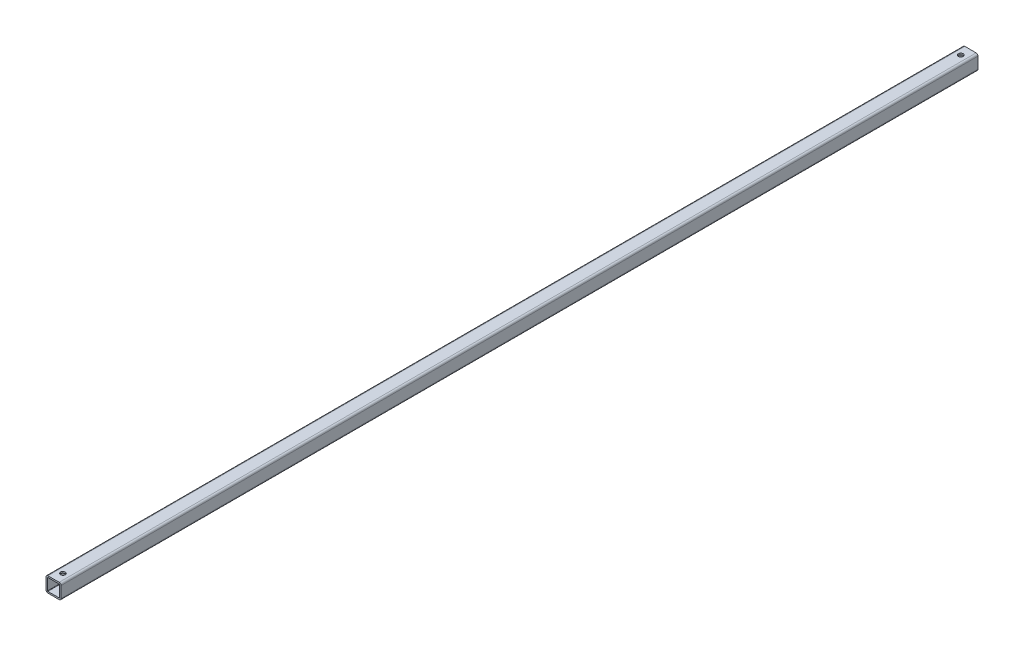
ISO-10303-21;
HEADER;
FILE_DESCRIPTION(('STEP AP214'),'2;1');
FILE_NAME('part.step','',(''),(''),'','','');
FILE_SCHEMA(('AUTOMOTIVE_DESIGN { 1 0 10303 214 1 1 1 1 }'));
ENDSEC;
DATA;
#1=APPLICATION_CONTEXT('core data for automotive mechanical design processes');
#2=APPLICATION_PROTOCOL_DEFINITION('international standard','automotive_design',2000,#1);
#3=PRODUCT_CONTEXT('',#1,'mechanical');
#4=PRODUCT('Part','Part','',(#3));
#5=PRODUCT_RELATED_PRODUCT_CATEGORY('part','',(#4));
#6=PRODUCT_DEFINITION_FORMATION('','',#4);
#7=PRODUCT_DEFINITION_CONTEXT('part definition',#1,'design');
#8=PRODUCT_DEFINITION('design','',#6,#7);
#9=PRODUCT_DEFINITION_SHAPE('','',#8);
#10=(LENGTH_UNIT() NAMED_UNIT(*) SI_UNIT(.MILLI.,.METRE.));
#11=(NAMED_UNIT(*) PLANE_ANGLE_UNIT() SI_UNIT($,.RADIAN.));
#12=(NAMED_UNIT(*) SI_UNIT($,.STERADIAN.) SOLID_ANGLE_UNIT());
#13=UNCERTAINTY_MEASURE_WITH_UNIT(LENGTH_MEASURE(1.E-05),#10,'distance_accuracy_value','');
#14=(GEOMETRIC_REPRESENTATION_CONTEXT(3) GLOBAL_UNCERTAINTY_ASSIGNED_CONTEXT((#13)) GLOBAL_UNIT_ASSIGNED_CONTEXT((#10,
#11,#12)) REPRESENTATION_CONTEXT('',''));
#15=CARTESIAN_POINT('',(0.,0.,0.));
#16=DIRECTION('',(0.,0.,1.));
#17=DIRECTION('',(1.,0.,0.));
#18=AXIS2_PLACEMENT_3D('',#15,#16,#17);
#19=CARTESIAN_POINT('',(-7.5,7.5,609.6));
#20=DIRECTION('',(0.,0.,1.));
#21=DIRECTION('',(1.,0.,0.));
#22=AXIS2_PLACEMENT_3D('',#19,#20,#21);
#23=PLANE('',#22);
#24=CARTESIAN_POINT('',(-7.5,7.5,609.6));
#25=DIRECTION('',(0.,0.,1.));
#26=DIRECTION('',(1.,0.,0.));
#27=AXIS2_PLACEMENT_3D('',#24,#25,#26);
#28=CIRCLE('',#27,2.5);
#29=CARTESIAN_POINT('',(-7.5,10.,609.6));
#30=VERTEX_POINT('',#29);
#31=CARTESIAN_POINT('',(-10.,7.5,609.6));
#32=VERTEX_POINT('',#31);
#33=EDGE_CURVE('E263',#30,#32,#28,.T.);
#34=ORIENTED_EDGE('',*,*,#33,.T.);
#35=DIRECTION('',(0.,-1.,0.));
#36=VECTOR('',#35,1.);
#37=CARTESIAN_POINT('',(-10.,-7.5,609.6));
#38=LINE('',#37,#36);
#39=CARTESIAN_POINT('',(-10.,-7.5,609.6));
#40=VERTEX_POINT('',#39);
#41=EDGE_CURVE('E266',#32,#40,#38,.T.);
#42=ORIENTED_EDGE('',*,*,#41,.T.);
#43=CARTESIAN_POINT('',(-7.5,-7.5,609.6));
#44=DIRECTION('',(0.,0.,1.));
#45=DIRECTION('',(-1.,0.,0.));
#46=AXIS2_PLACEMENT_3D('',#43,#44,#45);
#47=CIRCLE('',#46,2.5);
#48=CARTESIAN_POINT('',(-7.5,-10.,609.6));
#49=VERTEX_POINT('',#48);
#50=EDGE_CURVE('E269',#40,#49,#47,.T.);
#51=ORIENTED_EDGE('',*,*,#50,.T.);
#52=DIRECTION('',(1.,0.,0.));
#53=VECTOR('',#52,1.);
#54=CARTESIAN_POINT('',(7.5,-10.,609.6));
#55=LINE('',#54,#53);
#56=CARTESIAN_POINT('',(7.5,-10.,609.6));
#57=VERTEX_POINT('',#56);
#58=EDGE_CURVE('E271',#49,#57,#55,.T.);
#59=ORIENTED_EDGE('',*,*,#58,.T.);
#60=CARTESIAN_POINT('',(7.5,-7.5,609.6));
#61=DIRECTION('',(0.,0.,1.));
#62=DIRECTION('',(1.,0.,0.));
#63=AXIS2_PLACEMENT_3D('',#60,#61,#62);
#64=CIRCLE('',#63,2.5);
#65=CARTESIAN_POINT('',(10.,-7.5,609.6));
#66=VERTEX_POINT('',#65);
#67=EDGE_CURVE('E273',#57,#66,#64,.T.);
#68=ORIENTED_EDGE('',*,*,#67,.T.);
#69=DIRECTION('',(0.,1.,0.));
#70=VECTOR('',#69,1.);
#71=CARTESIAN_POINT('',(10.,-7.5,609.6));
#72=LINE('',#71,#70);
#73=CARTESIAN_POINT('',(10.,7.5,609.6));
#74=VERTEX_POINT('',#73);
#75=EDGE_CURVE('E275',#66,#74,#72,.T.);
#76=ORIENTED_EDGE('',*,*,#75,.T.);
#77=CARTESIAN_POINT('',(7.5,7.5,609.6));
#78=DIRECTION('',(0.,0.,1.));
#79=DIRECTION('',(1.,0.,0.));
#80=AXIS2_PLACEMENT_3D('',#77,#78,#79);
#81=CIRCLE('',#80,2.5);
#82=CARTESIAN_POINT('',(7.5,10.,609.6));
#83=VERTEX_POINT('',#82);
#84=EDGE_CURVE('E277',#74,#83,#81,.T.);
#85=ORIENTED_EDGE('',*,*,#84,.T.);
#86=DIRECTION('',(-1.,0.,0.));
#87=VECTOR('',#86,1.);
#88=CARTESIAN_POINT('',(7.5,10.,609.6));
#89=LINE('',#88,#87);
#90=EDGE_CURVE('E279',#83,#30,#89,.T.);
#91=ORIENTED_EDGE('',*,*,#90,.T.);
#92=EDGE_LOOP('',(#34,#42,#51,#59,#68,#76,#85,#91));
#93=FACE_BOUND('',#92,.T.);
#94=DIRECTION('',(0.,-1.,0.));
#95=VECTOR('',#94,1.);
#96=CARTESIAN_POINT('',(-8.,-7.5,609.6));
#97=LINE('',#96,#95);
#98=CARTESIAN_POINT('',(-8.,7.5,609.6));
#99=VERTEX_POINT('',#98);
#100=CARTESIAN_POINT('',(-8.,-7.5,609.6));
#101=VERTEX_POINT('',#100);
#102=EDGE_CURVE('E204',#99,#101,#97,.T.);
#103=ORIENTED_EDGE('',*,*,#102,.F.);
#104=CARTESIAN_POINT('',(-7.5,7.5,609.6));
#105=DIRECTION('',(0.,0.,1.));
#106=DIRECTION('',(1.,0.,0.));
#107=AXIS2_PLACEMENT_3D('',#104,#105,#106);
#108=CIRCLE('',#107,0.499999999999999);
#109=CARTESIAN_POINT('',(-7.5,8.,609.6));
#110=VERTEX_POINT('',#109);
#111=EDGE_CURVE('E196',#110,#99,#108,.T.);
#112=ORIENTED_EDGE('',*,*,#111,.F.);
#113=DIRECTION('',(-1.,0.,0.));
#114=VECTOR('',#113,1.);
#115=CARTESIAN_POINT('',(7.5,8.,609.6));
#116=LINE('',#115,#114);
#117=CARTESIAN_POINT('',(7.5,8.,609.6));
#118=VERTEX_POINT('',#117);
#119=EDGE_CURVE('E230',#118,#110,#116,.T.);
#120=ORIENTED_EDGE('',*,*,#119,.F.);
#121=CARTESIAN_POINT('',(7.5,7.5,609.6));
#122=DIRECTION('',(0.,0.,1.));
#123=DIRECTION('',(1.,0.,0.));
#124=AXIS2_PLACEMENT_3D('',#121,#122,#123);
#125=CIRCLE('',#124,0.499999999999999);
#126=CARTESIAN_POINT('',(8.,7.5,609.6));
#127=VERTEX_POINT('',#126);
#128=EDGE_CURVE('E228',#127,#118,#125,.T.);
#129=ORIENTED_EDGE('',*,*,#128,.F.);
#130=DIRECTION('',(0.,1.,0.));
#131=VECTOR('',#130,1.);
#132=CARTESIAN_POINT('',(8.,-7.5,609.6));
#133=LINE('',#132,#131);
#134=CARTESIAN_POINT('',(8.,-7.5,609.6));
#135=VERTEX_POINT('',#134);
#136=EDGE_CURVE('E226',#135,#127,#133,.T.);
#137=ORIENTED_EDGE('',*,*,#136,.F.);
#138=CARTESIAN_POINT('',(7.5,-7.5,609.6));
#139=DIRECTION('',(0.,0.,1.));
#140=DIRECTION('',(1.,0.,0.));
#141=AXIS2_PLACEMENT_3D('',#138,#139,#140);
#142=CIRCLE('',#141,0.500000000000001);
#143=CARTESIAN_POINT('',(7.5,-8.,609.6));
#144=VERTEX_POINT('',#143);
#145=EDGE_CURVE('E224',#144,#135,#142,.T.);
#146=ORIENTED_EDGE('',*,*,#145,.F.);
#147=DIRECTION('',(1.,0.,0.));
#148=VECTOR('',#147,1.);
#149=CARTESIAN_POINT('',(7.5,-8.,609.6));
#150=LINE('',#149,#148);
#151=CARTESIAN_POINT('',(-7.5,-8.,609.6));
#152=VERTEX_POINT('',#151);
#153=EDGE_CURVE('E219',#152,#144,#150,.T.);
#154=ORIENTED_EDGE('',*,*,#153,.F.);
#155=CARTESIAN_POINT('',(-7.5,-7.5,609.6));
#156=DIRECTION('',(0.,0.,1.));
#157=DIRECTION('',(1.,0.,0.));
#158=AXIS2_PLACEMENT_3D('',#155,#156,#157);
#159=CIRCLE('',#158,0.500000000000002);
#160=EDGE_CURVE('E217',#101,#152,#159,.T.);
#161=ORIENTED_EDGE('',*,*,#160,.F.);
#162=EDGE_LOOP('',(#103,#112,#120,#129,#137,#146,#154,#161));
#163=FACE_BOUND('',#162,.T.);
#164=ADVANCED_FACE('F81',(#93,#163),#23,.T.);
#165=CARTESIAN_POINT('',(-7.5,7.5,-609.6));
#166=DIRECTION('',(0.,0.,1.));
#167=DIRECTION('',(1.,0.,0.));
#168=AXIS2_PLACEMENT_3D('',#165,#166,#167);
#169=PLANE('',#168);
#170=CARTESIAN_POINT('',(-7.5,7.5,-609.6));
#171=DIRECTION('',(0.,0.,1.));
#172=DIRECTION('',(1.,0.,0.));
#173=AXIS2_PLACEMENT_3D('',#170,#171,#172);
#174=CIRCLE('',#173,2.5);
#175=CARTESIAN_POINT('',(-7.5,10.,-609.6));
#176=VERTEX_POINT('',#175);
#177=CARTESIAN_POINT('',(-10.,7.5,-609.6));
#178=VERTEX_POINT('',#177);
#179=EDGE_CURVE('E212',#176,#178,#174,.T.);
#180=ORIENTED_EDGE('',*,*,#179,.F.);
#181=DIRECTION('',(-1.,0.,0.));
#182=VECTOR('',#181,1.);
#183=CARTESIAN_POINT('',(7.5,10.,-609.6));
#184=LINE('',#183,#182);
#185=CARTESIAN_POINT('',(7.5,10.,-609.6));
#186=VERTEX_POINT('',#185);
#187=EDGE_CURVE('E267',#186,#176,#184,.T.);
#188=ORIENTED_EDGE('',*,*,#187,.F.);
#189=CARTESIAN_POINT('',(7.5,7.5,-609.6));
#190=DIRECTION('',(0.,0.,1.));
#191=DIRECTION('',(1.,0.,0.));
#192=AXIS2_PLACEMENT_3D('',#189,#190,#191);
#193=CIRCLE('',#192,2.5);
#194=CARTESIAN_POINT('',(10.,7.5,-609.6));
#195=VERTEX_POINT('',#194);
#196=EDGE_CURVE('E294',#195,#186,#193,.T.);
#197=ORIENTED_EDGE('',*,*,#196,.F.);
#198=DIRECTION('',(0.,1.,0.));
#199=VECTOR('',#198,1.);
#200=CARTESIAN_POINT('',(10.,-7.5,-609.6));
#201=LINE('',#200,#199);
#202=CARTESIAN_POINT('',(10.,-7.5,-609.6));
#203=VERTEX_POINT('',#202);
#204=EDGE_CURVE('E292',#203,#195,#201,.T.);
#205=ORIENTED_EDGE('',*,*,#204,.F.);
#206=CARTESIAN_POINT('',(7.5,-7.5,-609.6));
#207=DIRECTION('',(0.,0.,1.));
#208=DIRECTION('',(1.,0.,0.));
#209=AXIS2_PLACEMENT_3D('',#206,#207,#208);
#210=CIRCLE('',#209,2.5);
#211=CARTESIAN_POINT('',(7.5,-10.,-609.6));
#212=VERTEX_POINT('',#211);
#213=EDGE_CURVE('E290',#212,#203,#210,.T.);
#214=ORIENTED_EDGE('',*,*,#213,.F.);
#215=DIRECTION('',(1.,0.,0.));
#216=VECTOR('',#215,1.);
#217=CARTESIAN_POINT('',(7.5,-10.,-609.6));
#218=LINE('',#217,#216);
#219=CARTESIAN_POINT('',(-7.5,-10.,-609.6));
#220=VERTEX_POINT('',#219);
#221=EDGE_CURVE('E288',#220,#212,#218,.T.);
#222=ORIENTED_EDGE('',*,*,#221,.F.);
#223=CARTESIAN_POINT('',(-7.5,-7.5,-609.6));
#224=DIRECTION('',(0.,0.,1.));
#225=DIRECTION('',(-1.,0.,0.));
#226=AXIS2_PLACEMENT_3D('',#223,#224,#225);
#227=CIRCLE('',#226,2.5);
#228=CARTESIAN_POINT('',(-10.,-7.5,-609.6));
#229=VERTEX_POINT('',#228);
#230=EDGE_CURVE('E286',#229,#220,#227,.T.);
#231=ORIENTED_EDGE('',*,*,#230,.F.);
#232=DIRECTION('',(0.,-1.,0.));
#233=VECTOR('',#232,1.);
#234=CARTESIAN_POINT('',(-10.,-7.5,-609.6));
#235=LINE('',#234,#233);
#236=EDGE_CURVE('E284',#178,#229,#235,.T.);
#237=ORIENTED_EDGE('',*,*,#236,.F.);
#238=EDGE_LOOP('',(#180,#188,#197,#205,#214,#222,#231,#237));
#239=FACE_BOUND('',#238,.T.);
#240=CARTESIAN_POINT('',(-7.5,7.5,-609.6));
#241=DIRECTION('',(0.,0.,1.));
#242=DIRECTION('',(1.,0.,0.));
#243=AXIS2_PLACEMENT_3D('',#240,#241,#242);
#244=CIRCLE('',#243,0.499999999999999);
#245=CARTESIAN_POINT('',(-7.5,8.,-609.6));
#246=VERTEX_POINT('',#245);
#247=CARTESIAN_POINT('',(-8.,7.5,-609.6));
#248=VERTEX_POINT('',#247);
#249=EDGE_CURVE('E106',#246,#248,#244,.T.);
#250=ORIENTED_EDGE('',*,*,#249,.T.);
#251=DIRECTION('',(0.,-1.,0.));
#252=VECTOR('',#251,1.);
#253=CARTESIAN_POINT('',(-8.,-7.5,-609.6));
#254=LINE('',#253,#252);
#255=CARTESIAN_POINT('',(-8.,-7.5,-609.6));
#256=VERTEX_POINT('',#255);
#257=EDGE_CURVE('E211',#248,#256,#254,.T.);
#258=ORIENTED_EDGE('',*,*,#257,.T.);
#259=CARTESIAN_POINT('',(-7.5,-7.5,-609.6));
#260=DIRECTION('',(0.,0.,1.));
#261=DIRECTION('',(1.,0.,0.));
#262=AXIS2_PLACEMENT_3D('',#259,#260,#261);
#263=CIRCLE('',#262,0.500000000000002);
#264=CARTESIAN_POINT('',(-7.5,-8.,-609.6));
#265=VERTEX_POINT('',#264);
#266=EDGE_CURVE('E235',#256,#265,#263,.T.);
#267=ORIENTED_EDGE('',*,*,#266,.T.);
#268=DIRECTION('',(1.,0.,0.));
#269=VECTOR('',#268,1.);
#270=CARTESIAN_POINT('',(7.5,-8.,-609.6));
#271=LINE('',#270,#269);
#272=CARTESIAN_POINT('',(7.5,-8.,-609.6));
#273=VERTEX_POINT('',#272);
#274=EDGE_CURVE('E238',#265,#273,#271,.T.);
#275=ORIENTED_EDGE('',*,*,#274,.T.);
#276=CARTESIAN_POINT('',(7.5,-7.5,-609.6));
#277=DIRECTION('',(0.,0.,1.));
#278=DIRECTION('',(1.,0.,0.));
#279=AXIS2_PLACEMENT_3D('',#276,#277,#278);
#280=CIRCLE('',#279,0.500000000000001);
#281=CARTESIAN_POINT('',(8.,-7.5,-609.6));
#282=VERTEX_POINT('',#281);
#283=EDGE_CURVE('E241',#273,#282,#280,.T.);
#284=ORIENTED_EDGE('',*,*,#283,.T.);
#285=DIRECTION('',(0.,1.,0.));
#286=VECTOR('',#285,1.);
#287=CARTESIAN_POINT('',(8.,-7.5,-609.6));
#288=LINE('',#287,#286);
#289=CARTESIAN_POINT('',(8.,7.5,-609.6));
#290=VERTEX_POINT('',#289);
#291=EDGE_CURVE('E244',#282,#290,#288,.T.);
#292=ORIENTED_EDGE('',*,*,#291,.T.);
#293=CARTESIAN_POINT('',(7.5,7.5,-609.6));
#294=DIRECTION('',(0.,0.,1.));
#295=DIRECTION('',(1.,0.,0.));
#296=AXIS2_PLACEMENT_3D('',#293,#294,#295);
#297=CIRCLE('',#296,0.499999999999999);
#298=CARTESIAN_POINT('',(7.5,8.,-609.6));
#299=VERTEX_POINT('',#298);
#300=EDGE_CURVE('E247',#290,#299,#297,.T.);
#301=ORIENTED_EDGE('',*,*,#300,.T.);
#302=DIRECTION('',(-1.,0.,0.));
#303=VECTOR('',#302,1.);
#304=CARTESIAN_POINT('',(7.5,8.,-609.6));
#305=LINE('',#304,#303);
#306=EDGE_CURVE('E205',#299,#246,#305,.T.);
#307=ORIENTED_EDGE('',*,*,#306,.T.);
#308=EDGE_LOOP('',(#250,#258,#267,#275,#284,#292,#301,#307));
#309=FACE_BOUND('',#308,.T.);
#310=ADVANCED_FACE('F354',(#239,#309),#169,.F.);
#311=CARTESIAN_POINT('',(-7.5,7.5,609.6));
#312=DIRECTION('',(0.,0.,-1.));
#313=DIRECTION('',(-1.,0.,0.));
#314=AXIS2_PLACEMENT_3D('',#311,#312,#313);
#315=CYLINDRICAL_SURFACE('',#314,2.5);
#316=ORIENTED_EDGE('',*,*,#179,.T.);
#317=DIRECTION('',(0.,0.,-1.));
#318=VECTOR('',#317,1.);
#319=CARTESIAN_POINT('',(-10.,7.5,609.6));
#320=LINE('',#319,#318);
#321=EDGE_CURVE('E12',#32,#178,#320,.T.);
#322=ORIENTED_EDGE('',*,*,#321,.F.);
#323=ORIENTED_EDGE('',*,*,#33,.F.);
#324=DIRECTION('',(0.,0.,-1.));
#325=VECTOR('',#324,1.);
#326=CARTESIAN_POINT('',(-7.5,10.,609.6));
#327=LINE('',#326,#325);
#328=EDGE_CURVE('E281',#30,#176,#327,.T.);
#329=ORIENTED_EDGE('',*,*,#328,.T.);
#330=EDGE_LOOP('',(#316,#322,#323,#329));
#331=FACE_BOUND('',#330,.T.);
#332=ADVANCED_FACE('F83',(#331),#315,.T.);
#333=CARTESIAN_POINT('',(-10.,-7.5,609.6));
#334=DIRECTION('',(1.,0.,0.));
#335=DIRECTION('',(0.,1.,0.));
#336=AXIS2_PLACEMENT_3D('',#333,#334,#335);
#337=PLANE('',#336);
#338=ORIENTED_EDGE('',*,*,#236,.T.);
#339=DIRECTION('',(0.,0.,-1.));
#340=VECTOR('',#339,1.);
#341=CARTESIAN_POINT('',(-10.,-7.5,609.6));
#342=LINE('',#341,#340);
#343=EDGE_CURVE('E90',#40,#229,#342,.T.);
#344=ORIENTED_EDGE('',*,*,#343,.F.);
#345=ORIENTED_EDGE('',*,*,#41,.F.);
#346=ORIENTED_EDGE('',*,*,#321,.T.);
#347=EDGE_LOOP('',(#338,#344,#345,#346));
#348=FACE_BOUND('',#347,.T.);
#349=ADVANCED_FACE('F386',(#348),#337,.F.);
#350=CARTESIAN_POINT('',(-7.5,-7.5,609.6));
#351=DIRECTION('',(0.,0.,-1.));
#352=DIRECTION('',(-1.,0.,0.));
#353=AXIS2_PLACEMENT_3D('',#350,#351,#352);
#354=CYLINDRICAL_SURFACE('',#353,2.5);
#355=ORIENTED_EDGE('',*,*,#230,.T.);
#356=DIRECTION('',(0.,0.,-1.));
#357=VECTOR('',#356,1.);
#358=CARTESIAN_POINT('',(-7.5,-10.,609.6));
#359=LINE('',#358,#357);
#360=EDGE_CURVE('E311',#49,#220,#359,.T.);
#361=ORIENTED_EDGE('',*,*,#360,.F.);
#362=ORIENTED_EDGE('',*,*,#50,.F.);
#363=ORIENTED_EDGE('',*,*,#343,.T.);
#364=EDGE_LOOP('',(#355,#361,#362,#363));
#365=FACE_BOUND('',#364,.T.);
#366=ADVANCED_FACE('F383',(#365),#354,.T.);
#367=CARTESIAN_POINT('',(7.5,-10.,609.6));
#368=DIRECTION('',(0.,1.,0.));
#369=DIRECTION('',(-1.,0.,0.));
#370=AXIS2_PLACEMENT_3D('',#367,#368,#369);
#371=PLANE('',#370);
#372=CARTESIAN_POINT('',(-0.200000000000001,-10.,-596.9));
#373=DIRECTION('',(0.,1.,0.));
#374=DIRECTION('',(-1.,0.,0.));
#375=AXIS2_PLACEMENT_3D('',#372,#373,#374);
#376=CIRCLE('',#375,3.175);
#377=CARTESIAN_POINT('',(-3.375,-10.,-596.9));
#378=VERTEX_POINT('',#377);
#379=EDGE_CURVE('E324',#378,#378,#376,.T.);
#380=ORIENTED_EDGE('',*,*,#379,.T.);
#381=EDGE_LOOP('',(#380));
#382=FACE_BOUND('',#381,.T.);
#383=CARTESIAN_POINT('',(-0.200000000000001,-10.,596.9));
#384=DIRECTION('',(0.,1.,0.));
#385=DIRECTION('',(-1.,0.,0.));
#386=AXIS2_PLACEMENT_3D('',#383,#384,#385);
#387=CIRCLE('',#386,3.175);
#388=CARTESIAN_POINT('',(-3.375,-10.,596.9));
#389=VERTEX_POINT('',#388);
#390=EDGE_CURVE('E233',#389,#389,#387,.T.);
#391=ORIENTED_EDGE('',*,*,#390,.T.);
#392=EDGE_LOOP('',(#391));
#393=FACE_BOUND('',#392,.T.);
#394=ORIENTED_EDGE('',*,*,#221,.T.);
#395=DIRECTION('',(0.,0.,-1.));
#396=VECTOR('',#395,1.);
#397=CARTESIAN_POINT('',(7.5,-10.,609.6));
#398=LINE('',#397,#396);
#399=EDGE_CURVE('E308',#57,#212,#398,.T.);
#400=ORIENTED_EDGE('',*,*,#399,.F.);
#401=ORIENTED_EDGE('',*,*,#58,.F.);
#402=ORIENTED_EDGE('',*,*,#360,.T.);
#403=EDGE_LOOP('',(#394,#400,#401,#402));
#404=FACE_BOUND('',#403,.T.);
#405=ADVANCED_FACE('F335',(#382,#393,#404),#371,.F.);
#406=CARTESIAN_POINT('',(7.5,-7.5,609.6));
#407=DIRECTION('',(0.,0.,-1.));
#408=DIRECTION('',(-1.,0.,0.));
#409=AXIS2_PLACEMENT_3D('',#406,#407,#408);
#410=CYLINDRICAL_SURFACE('',#409,2.5);
#411=ORIENTED_EDGE('',*,*,#213,.T.);
#412=DIRECTION('',(0.,0.,-1.));
#413=VECTOR('',#412,1.);
#414=CARTESIAN_POINT('',(10.,-7.5,609.6));
#415=LINE('',#414,#413);
#416=EDGE_CURVE('E305',#66,#203,#415,.T.);
#417=ORIENTED_EDGE('',*,*,#416,.F.);
#418=ORIENTED_EDGE('',*,*,#67,.F.);
#419=ORIENTED_EDGE('',*,*,#399,.T.);
#420=EDGE_LOOP('',(#411,#417,#418,#419));
#421=FACE_BOUND('',#420,.T.);
#422=ADVANCED_FACE('F376',(#421),#410,.T.);
#423=CARTESIAN_POINT('',(10.,-7.5,609.6));
#424=DIRECTION('',(-1.,0.,0.));
#425=DIRECTION('',(0.,-1.,0.));
#426=AXIS2_PLACEMENT_3D('',#423,#424,#425);
#427=PLANE('',#426);
#428=ORIENTED_EDGE('',*,*,#204,.T.);
#429=DIRECTION('',(0.,0.,-1.));
#430=VECTOR('',#429,1.);
#431=CARTESIAN_POINT('',(10.,7.5,609.6));
#432=LINE('',#431,#430);
#433=EDGE_CURVE('E302',#74,#195,#432,.T.);
#434=ORIENTED_EDGE('',*,*,#433,.F.);
#435=ORIENTED_EDGE('',*,*,#75,.F.);
#436=ORIENTED_EDGE('',*,*,#416,.T.);
#437=EDGE_LOOP('',(#428,#434,#435,#436));
#438=FACE_BOUND('',#437,.T.);
#439=ADVANCED_FACE('F372',(#438),#427,.F.);
#440=CARTESIAN_POINT('',(7.5,7.5,609.6));
#441=DIRECTION('',(0.,0.,-1.));
#442=DIRECTION('',(-1.,0.,0.));
#443=AXIS2_PLACEMENT_3D('',#440,#441,#442);
#444=CYLINDRICAL_SURFACE('',#443,2.5);
#445=ORIENTED_EDGE('',*,*,#196,.T.);
#446=DIRECTION('',(0.,0.,-1.));
#447=VECTOR('',#446,1.);
#448=CARTESIAN_POINT('',(7.5,10.,609.6));
#449=LINE('',#448,#447);
#450=EDGE_CURVE('E299',#83,#186,#449,.T.);
#451=ORIENTED_EDGE('',*,*,#450,.F.);
#452=ORIENTED_EDGE('',*,*,#84,.F.);
#453=ORIENTED_EDGE('',*,*,#433,.T.);
#454=EDGE_LOOP('',(#445,#451,#452,#453));
#455=FACE_BOUND('',#454,.T.);
#456=ADVANCED_FACE('F368',(#455),#444,.T.);
#457=CARTESIAN_POINT('',(7.5,10.,609.6));
#458=DIRECTION('',(0.,-1.,0.));
#459=DIRECTION('',(1.,0.,0.));
#460=AXIS2_PLACEMENT_3D('',#457,#458,#459);
#461=PLANE('',#460);
#462=CARTESIAN_POINT('',(-0.200000000000001,10.,-596.9));
#463=DIRECTION('',(0.,1.,0.));
#464=DIRECTION('',(0.,0.,1.));
#465=AXIS2_PLACEMENT_3D('',#462,#463,#464);
#466=CIRCLE('',#465,3.175);
#467=CARTESIAN_POINT('',(-0.200000000000001,10.,-593.725));
#468=VERTEX_POINT('',#467);
#469=EDGE_CURVE('E502',#468,#468,#466,.T.);
#470=ORIENTED_EDGE('',*,*,#469,.F.);
#471=EDGE_LOOP('',(#470));
#472=FACE_BOUND('',#471,.T.);
#473=CARTESIAN_POINT('',(-0.200000000000001,10.,596.9));
#474=DIRECTION('',(0.,1.,0.));
#475=DIRECTION('',(0.,0.,1.));
#476=AXIS2_PLACEMENT_3D('',#473,#474,#475);
#477=CIRCLE('',#476,3.175);
#478=CARTESIAN_POINT('',(-0.200000000000001,10.,600.075));
#479=VERTEX_POINT('',#478);
#480=EDGE_CURVE('E318',#479,#479,#477,.T.);
#481=ORIENTED_EDGE('',*,*,#480,.F.);
#482=EDGE_LOOP('',(#481));
#483=FACE_BOUND('',#482,.T.);
#484=ORIENTED_EDGE('',*,*,#187,.T.);
#485=ORIENTED_EDGE('',*,*,#328,.F.);
#486=ORIENTED_EDGE('',*,*,#90,.F.);
#487=ORIENTED_EDGE('',*,*,#450,.T.);
#488=EDGE_LOOP('',(#484,#485,#486,#487));
#489=FACE_BOUND('',#488,.T.);
#490=ADVANCED_FACE('F365',(#472,#483,#489),#461,.F.);
#491=CARTESIAN_POINT('',(-7.5,7.5,609.6));
#492=DIRECTION('',(0.,0.,-1.));
#493=DIRECTION('',(-1.,0.,0.));
#494=AXIS2_PLACEMENT_3D('',#491,#492,#493);
#495=CYLINDRICAL_SURFACE('',#494,0.499999999999999);
#496=ORIENTED_EDGE('',*,*,#249,.F.);
#497=DIRECTION('',(0.,0.,-1.));
#498=VECTOR('',#497,1.);
#499=CARTESIAN_POINT('',(-7.5,8.,609.6));
#500=LINE('',#499,#498);
#501=EDGE_CURVE('E200',#110,#246,#500,.T.);
#502=ORIENTED_EDGE('',*,*,#501,.F.);
#503=ORIENTED_EDGE('',*,*,#111,.T.);
#504=DIRECTION('',(0.,0.,-1.));
#505=VECTOR('',#504,1.);
#506=CARTESIAN_POINT('',(-8.,7.5,609.6));
#507=LINE('',#506,#505);
#508=EDGE_CURVE('E199',#99,#248,#507,.T.);
#509=ORIENTED_EDGE('',*,*,#508,.T.);
#510=EDGE_LOOP('',(#496,#502,#503,#509));
#511=FACE_BOUND('',#510,.T.);
#512=ADVANCED_FACE('F198',(#511),#495,.F.);
#513=CARTESIAN_POINT('',(-8.,-7.5,609.6));
#514=DIRECTION('',(1.,0.,0.));
#515=DIRECTION('',(0.,1.,0.));
#516=AXIS2_PLACEMENT_3D('',#513,#514,#515);
#517=PLANE('',#516);
#518=ORIENTED_EDGE('',*,*,#257,.F.);
#519=ORIENTED_EDGE('',*,*,#508,.F.);
#520=ORIENTED_EDGE('',*,*,#102,.T.);
#521=DIRECTION('',(0.,0.,-1.));
#522=VECTOR('',#521,1.);
#523=CARTESIAN_POINT('',(-8.,-7.5,609.6));
#524=LINE('',#523,#522);
#525=EDGE_CURVE('E213',#101,#256,#524,.T.);
#526=ORIENTED_EDGE('',*,*,#525,.T.);
#527=EDGE_LOOP('',(#518,#519,#520,#526));
#528=FACE_BOUND('',#527,.T.);
#529=ADVANCED_FACE('F208',(#528),#517,.T.);
#530=CARTESIAN_POINT('',(-7.5,-7.5,609.6));
#531=DIRECTION('',(0.,0.,-1.));
#532=DIRECTION('',(-1.,0.,0.));
#533=AXIS2_PLACEMENT_3D('',#530,#531,#532);
#534=CYLINDRICAL_SURFACE('',#533,0.500000000000002);
#535=ORIENTED_EDGE('',*,*,#266,.F.);
#536=ORIENTED_EDGE('',*,*,#525,.F.);
#537=ORIENTED_EDGE('',*,*,#160,.T.);
#538=DIRECTION('',(0.,0.,-1.));
#539=VECTOR('',#538,1.);
#540=CARTESIAN_POINT('',(-7.5,-8.,609.6));
#541=LINE('',#540,#539);
#542=EDGE_CURVE('E260',#152,#265,#541,.T.);
#543=ORIENTED_EDGE('',*,*,#542,.T.);
#544=EDGE_LOOP('',(#535,#536,#537,#543));
#545=FACE_BOUND('',#544,.T.);
#546=ADVANCED_FACE('F438',(#545),#534,.F.);
#547=CARTESIAN_POINT('',(7.5,-8.,609.6));
#548=DIRECTION('',(0.,1.,0.));
#549=DIRECTION('',(-1.,0.,0.));
#550=AXIS2_PLACEMENT_3D('',#547,#548,#549);
#551=PLANE('',#550);
#552=CARTESIAN_POINT('',(-0.200000000000001,-8.,-596.9));
#553=DIRECTION('',(0.,1.,0.));
#554=DIRECTION('',(-1.,0.,0.));
#555=AXIS2_PLACEMENT_3D('',#552,#553,#554);
#556=CIRCLE('',#555,3.175);
#557=CARTESIAN_POINT('',(-3.375,-8.,-596.9));
#558=VERTEX_POINT('',#557);
#559=EDGE_CURVE('E85',#558,#558,#556,.T.);
#560=ORIENTED_EDGE('',*,*,#559,.F.);
#561=EDGE_LOOP('',(#560));
#562=FACE_BOUND('',#561,.T.);
#563=CARTESIAN_POINT('',(-0.200000000000001,-8.,596.9));
#564=DIRECTION('',(0.,1.,0.));
#565=DIRECTION('',(-1.,0.,0.));
#566=AXIS2_PLACEMENT_3D('',#563,#564,#565);
#567=CIRCLE('',#566,3.175);
#568=CARTESIAN_POINT('',(-3.375,-8.,596.9));
#569=VERTEX_POINT('',#568);
#570=EDGE_CURVE('E315',#569,#569,#567,.T.);
#571=ORIENTED_EDGE('',*,*,#570,.F.);
#572=EDGE_LOOP('',(#571));
#573=FACE_BOUND('',#572,.T.);
#574=ORIENTED_EDGE('',*,*,#274,.F.);
#575=ORIENTED_EDGE('',*,*,#542,.F.);
#576=ORIENTED_EDGE('',*,*,#153,.T.);
#577=DIRECTION('',(0.,0.,-1.));
#578=VECTOR('',#577,1.);
#579=CARTESIAN_POINT('',(7.5,-8.,609.6));
#580=LINE('',#579,#578);
#581=EDGE_CURVE('E258',#144,#273,#580,.T.);
#582=ORIENTED_EDGE('',*,*,#581,.T.);
#583=EDGE_LOOP('',(#574,#575,#576,#582));
#584=FACE_BOUND('',#583,.T.);
#585=ADVANCED_FACE('F435',(#562,#573,#584),#551,.T.);
#586=CARTESIAN_POINT('',(7.5,-7.5,609.6));
#587=DIRECTION('',(0.,0.,-1.));
#588=DIRECTION('',(-1.,0.,0.));
#589=AXIS2_PLACEMENT_3D('',#586,#587,#588);
#590=CYLINDRICAL_SURFACE('',#589,0.500000000000001);
#591=ORIENTED_EDGE('',*,*,#283,.F.);
#592=ORIENTED_EDGE('',*,*,#581,.F.);
#593=ORIENTED_EDGE('',*,*,#145,.T.);
#594=DIRECTION('',(0.,0.,-1.));
#595=VECTOR('',#594,1.);
#596=CARTESIAN_POINT('',(8.,-7.5,609.6));
#597=LINE('',#596,#595);
#598=EDGE_CURVE('E256',#135,#282,#597,.T.);
#599=ORIENTED_EDGE('',*,*,#598,.T.);
#600=EDGE_LOOP('',(#591,#592,#593,#599));
#601=FACE_BOUND('',#600,.T.);
#602=ADVANCED_FACE('F430',(#601),#590,.F.);
#603=CARTESIAN_POINT('',(8.,-7.5,609.6));
#604=DIRECTION('',(-1.,0.,0.));
#605=DIRECTION('',(0.,-1.,0.));
#606=AXIS2_PLACEMENT_3D('',#603,#604,#605);
#607=PLANE('',#606);
#608=ORIENTED_EDGE('',*,*,#291,.F.);
#609=ORIENTED_EDGE('',*,*,#598,.F.);
#610=ORIENTED_EDGE('',*,*,#136,.T.);
#611=DIRECTION('',(0.,0.,-1.));
#612=VECTOR('',#611,1.);
#613=CARTESIAN_POINT('',(8.,7.5,609.6));
#614=LINE('',#613,#612);
#615=EDGE_CURVE('E254',#127,#290,#614,.T.);
#616=ORIENTED_EDGE('',*,*,#615,.T.);
#617=EDGE_LOOP('',(#608,#609,#610,#616));
#618=FACE_BOUND('',#617,.T.);
#619=ADVANCED_FACE('F426',(#618),#607,.T.);
#620=CARTESIAN_POINT('',(7.5,7.5,609.6));
#621=DIRECTION('',(0.,0.,-1.));
#622=DIRECTION('',(-1.,0.,0.));
#623=AXIS2_PLACEMENT_3D('',#620,#621,#622);
#624=CYLINDRICAL_SURFACE('',#623,0.499999999999999);
#625=ORIENTED_EDGE('',*,*,#300,.F.);
#626=ORIENTED_EDGE('',*,*,#615,.F.);
#627=ORIENTED_EDGE('',*,*,#128,.T.);
#628=DIRECTION('',(0.,0.,-1.));
#629=VECTOR('',#628,1.);
#630=CARTESIAN_POINT('',(7.5,8.,609.6));
#631=LINE('',#630,#629);
#632=EDGE_CURVE('E98',#118,#299,#631,.T.);
#633=ORIENTED_EDGE('',*,*,#632,.T.);
#634=EDGE_LOOP('',(#625,#626,#627,#633));
#635=FACE_BOUND('',#634,.T.);
#636=ADVANCED_FACE('F349',(#635),#624,.F.);
#637=CARTESIAN_POINT('',(7.5,8.,609.6));
#638=DIRECTION('',(0.,-1.,0.));
#639=DIRECTION('',(1.,0.,0.));
#640=AXIS2_PLACEMENT_3D('',#637,#638,#639);
#641=PLANE('',#640);
#642=CARTESIAN_POINT('',(-0.200000000000001,8.,-596.9));
#643=DIRECTION('',(0.,-1.,0.));
#644=DIRECTION('',(1.,0.,0.));
#645=AXIS2_PLACEMENT_3D('',#642,#643,#644);
#646=CIRCLE('',#645,3.175);
#647=CARTESIAN_POINT('',(2.97499999999999,8.,-596.9));
#648=VERTEX_POINT('',#647);
#649=EDGE_CURVE('E329',#648,#648,#646,.T.);
#650=ORIENTED_EDGE('',*,*,#649,.F.);
#651=EDGE_LOOP('',(#650));
#652=FACE_BOUND('',#651,.T.);
#653=CARTESIAN_POINT('',(-0.200000000000001,8.,596.9));
#654=DIRECTION('',(0.,-1.,0.));
#655=DIRECTION('',(1.,0.,0.));
#656=AXIS2_PLACEMENT_3D('',#653,#654,#655);
#657=CIRCLE('',#656,3.175);
#658=CARTESIAN_POINT('',(2.97499999999999,8.,596.9));
#659=VERTEX_POINT('',#658);
#660=EDGE_CURVE('E317',#659,#659,#657,.T.);
#661=ORIENTED_EDGE('',*,*,#660,.F.);
#662=EDGE_LOOP('',(#661));
#663=FACE_BOUND('',#662,.T.);
#664=ORIENTED_EDGE('',*,*,#306,.F.);
#665=ORIENTED_EDGE('',*,*,#632,.F.);
#666=ORIENTED_EDGE('',*,*,#119,.T.);
#667=ORIENTED_EDGE('',*,*,#501,.T.);
#668=EDGE_LOOP('',(#664,#665,#666,#667));
#669=FACE_BOUND('',#668,.T.);
#670=ADVANCED_FACE('F341',(#652,#663,#669),#641,.T.);
#671=CARTESIAN_POINT('',(-0.200000000000001,10.,596.9));
#672=DIRECTION('',(0.,1.,0.));
#673=DIRECTION('',(0.,0.,1.));
#674=AXIS2_PLACEMENT_3D('',#671,#672,#673);
#675=CYLINDRICAL_SURFACE('',#674,3.175);
#676=ORIENTED_EDGE('',*,*,#570,.T.);
#677=EDGE_LOOP('',(#676));
#678=FACE_BOUND('',#677,.T.);
#679=ORIENTED_EDGE('',*,*,#390,.F.);
#680=EDGE_LOOP('',(#679));
#681=FACE_BOUND('',#680,.T.);
#682=ADVANCED_FACE('F338',(#678,#681),#675,.F.);
#683=ORIENTED_EDGE('',*,*,#660,.T.);
#684=EDGE_LOOP('',(#683));
#685=FACE_BOUND('',#684,.T.);
#686=ORIENTED_EDGE('',*,*,#480,.T.);
#687=EDGE_LOOP('',(#686));
#688=FACE_BOUND('',#687,.T.);
#689=ADVANCED_FACE('F340',(#685,#688),#675,.F.);
#690=CARTESIAN_POINT('',(-0.200000000000001,10.,-596.9));
#691=DIRECTION('',(0.,1.,0.));
#692=DIRECTION('',(0.,0.,1.));
#693=AXIS2_PLACEMENT_3D('',#690,#691,#692);
#694=CYLINDRICAL_SURFACE('',#693,3.175);
#695=ORIENTED_EDGE('',*,*,#559,.T.);
#696=EDGE_LOOP('',(#695));
#697=FACE_BOUND('',#696,.T.);
#698=ORIENTED_EDGE('',*,*,#379,.F.);
#699=EDGE_LOOP('',(#698));
#700=FACE_BOUND('',#699,.T.);
#701=ADVANCED_FACE('F347',(#697,#700),#694,.F.);
#702=ORIENTED_EDGE('',*,*,#649,.T.);
#703=EDGE_LOOP('',(#702));
#704=FACE_BOUND('',#703,.T.);
#705=ORIENTED_EDGE('',*,*,#469,.T.);
#706=EDGE_LOOP('',(#705));
#707=FACE_BOUND('',#706,.T.);
#708=ADVANCED_FACE('F485',(#704,#707),#694,.F.);
#709=CLOSED_SHELL('',(#164,#310,#332,#349,#366,#405,#422,#439,#456,#490,#512,#529,#546,#585,
#602,#619,#636,#670,#682,#689,#701,#708));
#710=MANIFOLD_SOLID_BREP('B2',#709);
#711=ADVANCED_BREP_SHAPE_REPRESENTATION('',(#18,#710),#14);
#712=SHAPE_DEFINITION_REPRESENTATION(#9,#711);
ENDSEC;
END-ISO-10303-21;
